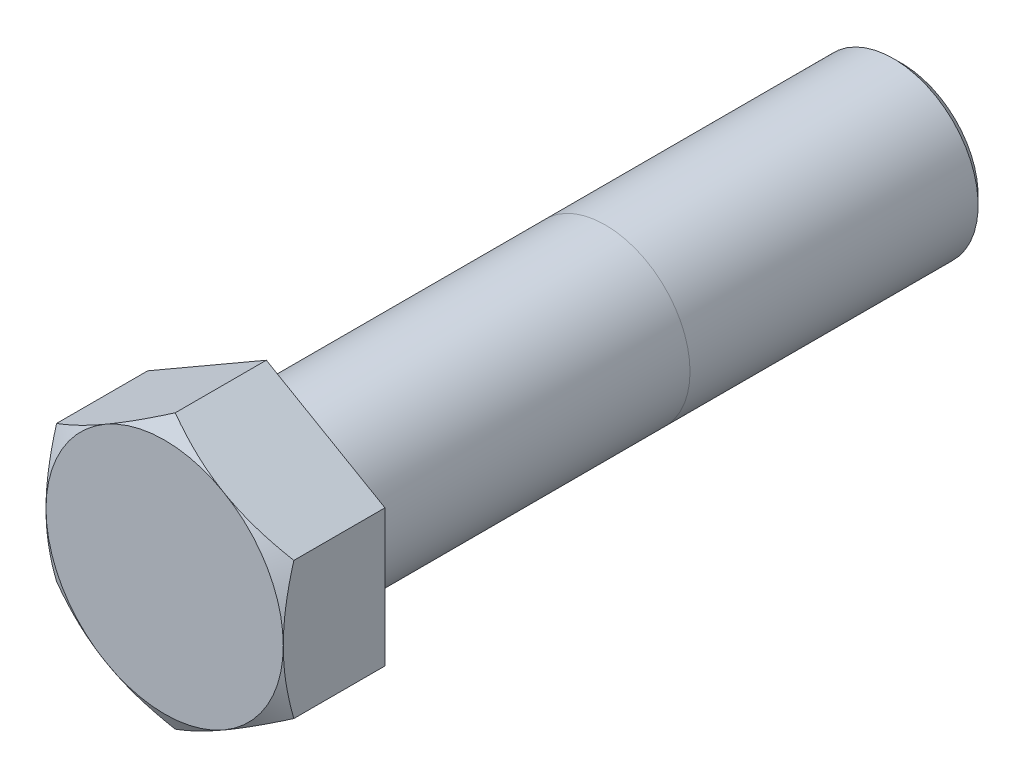
ISO-10303-21;
HEADER;
FILE_DESCRIPTION(('STEP AP214'),'2;1');
FILE_NAME('part.step','',(''),(''),'','','');
FILE_SCHEMA(('AUTOMOTIVE_DESIGN { 1 0 10303 214 1 1 1 1 }'));
ENDSEC;
DATA;
#1=APPLICATION_CONTEXT('core data for automotive mechanical design processes');
#2=APPLICATION_PROTOCOL_DEFINITION('international standard','automotive_design',2000,#1);
#3=PRODUCT_CONTEXT('',#1,'mechanical');
#4=PRODUCT('Part','Part','',(#3));
#5=PRODUCT_RELATED_PRODUCT_CATEGORY('part','',(#4));
#6=PRODUCT_DEFINITION_FORMATION('','',#4);
#7=PRODUCT_DEFINITION_CONTEXT('part definition',#1,'design');
#8=PRODUCT_DEFINITION('design','',#6,#7);
#9=PRODUCT_DEFINITION_SHAPE('','',#8);
#10=(LENGTH_UNIT() NAMED_UNIT(*) SI_UNIT(.MILLI.,.METRE.));
#11=(NAMED_UNIT(*) PLANE_ANGLE_UNIT() SI_UNIT($,.RADIAN.));
#12=(NAMED_UNIT(*) SI_UNIT($,.STERADIAN.) SOLID_ANGLE_UNIT());
#13=UNCERTAINTY_MEASURE_WITH_UNIT(LENGTH_MEASURE(1.E-05),#10,'distance_accuracy_value','');
#14=(GEOMETRIC_REPRESENTATION_CONTEXT(3) GLOBAL_UNCERTAINTY_ASSIGNED_CONTEXT((#13)) GLOBAL_UNIT_ASSIGNED_CONTEXT((#10,
#11,#12)) REPRESENTATION_CONTEXT('',''));
#15=CARTESIAN_POINT('',(0.,0.,0.));
#16=DIRECTION('',(0.,0.,1.));
#17=DIRECTION('',(1.,0.,0.));
#18=AXIS2_PLACEMENT_3D('',#15,#16,#17);
#19=CARTESIAN_POINT('',(0.,0.,-75.));
#20=DIRECTION('',(0.,0.,1.));
#21=DIRECTION('',(1.,0.,0.));
#22=AXIS2_PLACEMENT_3D('',#19,#20,#21);
#23=CYLINDRICAL_SURFACE('',#22,10.);
#24=CARTESIAN_POINT('',(0.,0.,0.));
#25=DIRECTION('',(0.,0.,-1.));
#26=DIRECTION('',(-1.,0.,0.));
#27=AXIS2_PLACEMENT_3D('',#24,#25,#26);
#28=CIRCLE('',#27,10.);
#29=CARTESIAN_POINT('',(-10.,0.,0.));
#30=VERTEX_POINT('',#29);
#31=EDGE_CURVE('E145',#30,#30,#28,.T.);
#32=ORIENTED_EDGE('',*,*,#31,.T.);
#33=EDGE_LOOP('',(#32));
#34=FACE_BOUND('',#33,.T.);
#35=CARTESIAN_POINT('',(0.,0.,-40.));
#36=DIRECTION('',(0.,0.,-1.));
#37=DIRECTION('',(-1.,0.,0.));
#38=AXIS2_PLACEMENT_3D('',#35,#36,#37);
#39=CIRCLE('',#38,10.);
#40=CARTESIAN_POINT('',(-10.,0.,-40.));
#41=VERTEX_POINT('',#40);
#42=CARTESIAN_POINT('',(10.,0.,-40.));
#43=VERTEX_POINT('',#42);
#44=EDGE_CURVE('E12',#41,#43,#39,.T.);
#45=ORIENTED_EDGE('',*,*,#44,.F.);
#46=EDGE_CURVE('E53',#43,#41,#39,.T.);
#47=ORIENTED_EDGE('',*,*,#46,.F.);
#48=EDGE_LOOP('',(#45,#47));
#49=FACE_BOUND('',#48,.T.);
#50=ADVANCED_FACE('F48',(#34,#49),#23,.T.);
#51=CARTESIAN_POINT('',(-14.,-8.08290376865476,12.));
#52=DIRECTION('',(0.5,0.866025403784439,0.));
#53=DIRECTION('',(-0.866025403784439,0.5,0.));
#54=AXIS2_PLACEMENT_3D('',#51,#52,#53);
#55=PLANE('',#54);
#56=CARTESIAN_POINT('',(-14.0002,-8.08278829860093,10.7495037679405));
#57=CARTESIAN_POINT('',(-13.6924853904181,-8.26044741127663,10.8520687355185));
#58=CARTESIAN_POINT('',(-13.3835705284393,-8.43879948999677,10.9499795109551));
#59=CARTESIAN_POINT('',(-12.7632636692859,-8.79693382210912,11.1351989694353));
#60=CARTESIAN_POINT('',(-12.4518708930622,-8.97671652528557,11.2225041654761));
#61=CARTESIAN_POINT('',(-11.8260063991707,-9.33805955931008,11.3853389062415));
#62=CARTESIAN_POINT('',(-11.5115292047329,-9.51962305217277,11.4608405894043));
#63=CARTESIAN_POINT('',(-10.8803895759989,-9.88401168671854,11.5984470625897));
#64=CARTESIAN_POINT('',(-10.5637272674325,-10.0668367558116,11.6605526168897));
#65=CARTESIAN_POINT('',(-9.93633151674919,-10.429063861357,11.7687252680104));
#66=CARTESIAN_POINT('',(-9.62564465325542,-10.6084390056288,11.8151503964399));
#67=CARTESIAN_POINT('',(-9.00284729327513,-10.968011229064,11.8929951265451));
#68=CARTESIAN_POINT('',(-8.69073676950318,-11.1482083239807,11.9244144393938));
#69=CARTESIAN_POINT('',(-8.06599141476663,-11.5089052227128,11.9714542186344));
#70=CARTESIAN_POINT('',(-7.75335765114504,-11.6894044102975,11.9870934589966));
#71=CARTESIAN_POINT('',(-7.12780152662096,-12.0505694071847,12.0022367596143));
#72=CARTESIAN_POINT('',(-6.81487917493453,-12.2312352111663,12.0017413184259));
#73=CARTESIAN_POINT('',(-6.22987230119103,-12.5689890871999,11.9857422399056));
#74=CARTESIAN_POINT('',(-5.95774609067864,-12.7261012280928,11.9721901053227));
#75=CARTESIAN_POINT('',(-5.41411962233189,-13.0399641159314,11.9331392398875));
#76=CARTESIAN_POINT('',(-5.14261941013851,-13.1967148365263,11.9076396640127));
#77=CARTESIAN_POINT('',(-4.60039240839667,-13.5097697419438,11.8451385190432));
#78=CARTESIAN_POINT('',(-4.32966644468921,-13.6660734499669,11.8081274502385));
#79=CARTESIAN_POINT('',(-3.78948373337593,-13.9779480837552,11.7232526731859));
#80=CARTESIAN_POINT('',(-3.52002707332628,-14.1335189589698,11.6753882271492));
#81=CARTESIAN_POINT('',(-2.70207638818785,-14.6057630072183,11.514304872236));
#82=CARTESIAN_POINT('',(-2.15595101855752,-14.9210686363857,11.3850242516312));
#83=CARTESIAN_POINT('',(-1.07184369066131,-15.546978293977,11.0916100987946));
#84=CARTESIAN_POINT('',(-0.533847852112653,-15.857590336186,10.9275454762133));
#85=CARTESIAN_POINT('',(0.000200000000002149,-16.1659230073634,10.7495037679405));
#86=B_SPLINE_CURVE_WITH_KNOTS('',3,(#56,#57,#58,#59,#60,#61,#62,#63,#64,#65,#66,#67,#68,#69,#70,
#71,#72,#73,#74,#75,#76,#77,#78,#79,#80,#81,#82,#83,#84,#85),.UNSPECIFIED.,.F.,.F.,(4,2,2,2,2,2,
2,2,2,2,2,2,2,2,4),(0.,1.10950436744395,2.21937254652007,3.33182219257025,4.44420835421649,
5.52913815688045,6.6140888410734,7.69774720328185,8.78137208085321,9.72469383358151,
10.6680823159394,11.6122513923123,12.5564846704803,14.4864746839191,16.412676387916),.UNSPECIFIED.);
#87=CARTESIAN_POINT('',(-14.,-8.0829037686548,10.7495704353215));
#88=VERTEX_POINT('',#87);
#89=CARTESIAN_POINT('',(-7.,-12.1243556529821,12.));
#90=VERTEX_POINT('',#89);
#91=EDGE_CURVE('E296',#88,#90,#86,.T.);
#92=ORIENTED_EDGE('',*,*,#91,.F.);
#93=DIRECTION('',(0.,0.,-1.));
#94=VECTOR('',#93,1.);
#95=CARTESIAN_POINT('',(-14.,-8.08290376865476,12.));
#96=LINE('',#95,#94);
#97=CARTESIAN_POINT('',(-14.,-8.08290376865476,0.));
#98=VERTEX_POINT('',#97);
#99=EDGE_CURVE('E272',#88,#98,#96,.T.);
#100=ORIENTED_EDGE('',*,*,#99,.T.);
#101=DIRECTION('',(0.866025403784439,-0.5,0.));
#102=VECTOR('',#101,1.);
#103=CARTESIAN_POINT('',(-14.,-8.08290376865476,0.));
#104=LINE('',#103,#102);
#105=CARTESIAN_POINT('',(0.,-16.1658075373095,0.));
#106=VERTEX_POINT('',#105);
#107=EDGE_CURVE('E293',#98,#106,#104,.T.);
#108=ORIENTED_EDGE('',*,*,#107,.T.);
#109=DIRECTION('',(0.,0.,-1.));
#110=VECTOR('',#109,1.);
#111=CARTESIAN_POINT('',(0.,-16.1658075373095,12.));
#112=LINE('',#111,#110);
#113=CARTESIAN_POINT('',(0.,-16.1658075373095,10.7495704353214));
#114=VERTEX_POINT('',#113);
#115=EDGE_CURVE('E258',#114,#106,#112,.T.);
#116=ORIENTED_EDGE('',*,*,#115,.F.);
#117=EDGE_CURVE('E198',#90,#114,#86,.T.);
#118=ORIENTED_EDGE('',*,*,#117,.F.);
#119=EDGE_LOOP('',(#92,#100,#108,#116,#118));
#120=FACE_BOUND('',#119,.T.);
#121=ADVANCED_FACE('F229',(#120),#55,.F.);
#122=CARTESIAN_POINT('',(0.,-16.1658075373095,12.));
#123=DIRECTION('',(-0.500000000000001,0.866025403784438,0.));
#124=DIRECTION('',(-0.866025403784438,-0.500000000000001,0.));
#125=AXIS2_PLACEMENT_3D('',#122,#123,#124);
#126=PLANE('',#125);
#127=CARTESIAN_POINT('',(-0.000199999999998869,-16.1659230073634,10.7495037679405));
#128=CARTESIAN_POINT('',(0.307514609581922,-15.9882638946877,10.8520687355185));
#129=CARTESIAN_POINT('',(0.61642947156072,-15.8099118159675,10.9499795109551));
#130=CARTESIAN_POINT('',(1.23673633071406,-15.4517774838552,11.1351989694353));
#131=CARTESIAN_POINT('',(1.54812910693776,-15.2719947806787,11.2225041654761));
#132=CARTESIAN_POINT('',(2.17399360082929,-14.9106517466542,11.3853389062415));
#133=CARTESIAN_POINT('',(2.48847079526713,-14.7290882537915,11.4608405894043));
#134=CARTESIAN_POINT('',(3.11961042400107,-14.3646996192458,11.5984470625896));
#135=CARTESIAN_POINT('',(3.43627273256746,-14.1818745501527,11.6605526168897));
#136=CARTESIAN_POINT('',(4.06366848325081,-13.8196474446073,11.7687252680104));
#137=CARTESIAN_POINT('',(4.37435534674457,-13.6402723003355,11.8151503964399));
#138=CARTESIAN_POINT('',(4.99715270672487,-13.2807000769003,11.8929951265451));
#139=CARTESIAN_POINT('',(5.30926323049682,-13.1005029819836,11.9244144393938));
#140=CARTESIAN_POINT('',(5.93400858523337,-12.7398060832515,11.9714542186344));
#141=CARTESIAN_POINT('',(6.24664234885497,-12.5593068956668,11.9870934589966));
#142=CARTESIAN_POINT('',(6.87219847337904,-12.1981418987796,12.0022367596143));
#143=CARTESIAN_POINT('',(7.18512082506547,-12.017476094798,12.0017413184259));
#144=CARTESIAN_POINT('',(7.77012769880897,-11.6797222187644,11.9857422399056));
#145=CARTESIAN_POINT('',(8.04225390932136,-11.5226100778715,11.9721901053227));
#146=CARTESIAN_POINT('',(8.58588037766811,-11.2087471900329,11.9331392398875));
#147=CARTESIAN_POINT('',(8.85738058986149,-11.051996469438,11.9076396640127));
#148=CARTESIAN_POINT('',(9.39960759160333,-10.7389415640205,11.8451385190432));
#149=CARTESIAN_POINT('',(9.67033355531079,-10.5826378559974,11.8081274502385));
#150=CARTESIAN_POINT('',(10.2105162666241,-10.2707632222091,11.7232526731859));
#151=CARTESIAN_POINT('',(10.4799729266737,-10.1151923469945,11.6753882271492));
#152=CARTESIAN_POINT('',(11.2979236118122,-9.64294829874594,11.514304872236));
#153=CARTESIAN_POINT('',(11.8440489814425,-9.32764266957859,11.3850242516312));
#154=CARTESIAN_POINT('',(12.9281563093387,-8.70173301198727,11.0916100987946));
#155=CARTESIAN_POINT('',(13.4661521478873,-8.3911209697783,10.9275454762133));
#156=CARTESIAN_POINT('',(14.0002,-8.08278829860092,10.7495037679405));
#157=B_SPLINE_CURVE_WITH_KNOTS('',3,(#127,#128,#129,#130,#131,#132,#133,#134,#135,#136,#137,
#138,#139,#140,#141,#142,#143,#144,#145,#146,#147,#148,#149,#150,#151,#152,#153,#154,#155,#156),
.UNSPECIFIED.,.F.,.F.,(4,2,2,2,2,2,2,2,2,2,2,2,2,2,4),(0.,1.10950436744395,2.21937254652007,
3.33182219257025,4.44420835421649,5.52913815688045,6.6140888410734,7.69774720328185,
8.78137208085321,9.72469383358151,10.6680823159394,11.6122513923123,12.5564846704803,
14.4864746839191,16.412676387916),.UNSPECIFIED.);
#158=CARTESIAN_POINT('',(7.00000000000001,-12.1243556529821,12.));
#159=VERTEX_POINT('',#158);
#160=EDGE_CURVE('E304',#114,#159,#157,.T.);
#161=ORIENTED_EDGE('',*,*,#160,.F.);
#162=ORIENTED_EDGE('',*,*,#115,.T.);
#163=DIRECTION('',(0.866025403784438,0.500000000000001,0.));
#164=VECTOR('',#163,1.);
#165=CARTESIAN_POINT('',(0.,-16.1658075373095,0.));
#166=LINE('',#165,#164);
#167=CARTESIAN_POINT('',(14.,-8.08290376865476,0.));
#168=VERTEX_POINT('',#167);
#169=EDGE_CURVE('E290',#106,#168,#166,.T.);
#170=ORIENTED_EDGE('',*,*,#169,.T.);
#171=DIRECTION('',(0.,0.,-1.));
#172=VECTOR('',#171,1.);
#173=CARTESIAN_POINT('',(14.,-8.08290376865476,12.));
#174=LINE('',#173,#172);
#175=CARTESIAN_POINT('',(14.,-8.08290376865476,10.7495704353214));
#176=VERTEX_POINT('',#175);
#177=EDGE_CURVE('E261',#176,#168,#174,.T.);
#178=ORIENTED_EDGE('',*,*,#177,.F.);
#179=EDGE_CURVE('E309',#159,#176,#157,.T.);
#180=ORIENTED_EDGE('',*,*,#179,.F.);
#181=EDGE_LOOP('',(#161,#162,#170,#178,#180));
#182=FACE_BOUND('',#181,.T.);
#183=ADVANCED_FACE('F234',(#182),#126,.F.);
#184=CARTESIAN_POINT('',(14.,-8.08290376865476,12.));
#185=DIRECTION('',(-1.,0.,0.));
#186=DIRECTION('',(0.,0.,1.));
#187=AXIS2_PLACEMENT_3D('',#184,#185,#186);
#188=PLANE('',#187);
#189=CARTESIAN_POINT('',(14.,-27.9498313890811,2.03488379712644));
#190=CARTESIAN_POINT('',(14.,-27.3001164004974,2.37023076111288));
#191=CARTESIAN_POINT('',(14.,-26.6494735941291,2.70379549218832));
#192=CARTESIAN_POINT('',(14.,-25.3458869305562,3.36647218065568));
#193=CARTESIAN_POINT('',(14.,-24.6929429660596,3.69558392686955));
#194=CARTESIAN_POINT('',(14.,-23.3833263693378,4.34895509189265));
#195=CARTESIAN_POINT('',(14.,-22.7266494511295,4.6732059344599));
#196=CARTESIAN_POINT('',(14.,-21.4100681833431,5.31507219467511));
#197=CARTESIAN_POINT('',(14.,-20.7501638839886,5.63268771517717));
#198=CARTESIAN_POINT('',(14.,-19.3911793293609,6.27639782623186));
#199=CARTESIAN_POINT('',(14.,-18.6918853351432,6.60204234665205));
#200=CARTESIAN_POINT('',(14.,-17.2879557164244,7.24172776898743));
#201=CARTESIAN_POINT('',(14.,-16.5833198771625,7.55576820136402));
#202=CARTESIAN_POINT('',(14.,-15.167908774893,8.16867739244114));
#203=CARTESIAN_POINT('',(14.,-14.4571370411742,8.46755427059979));
#204=CARTESIAN_POINT('',(14.,-13.0276643302037,9.04570148645687));
#205=CARTESIAN_POINT('',(14.,-12.3089641296015,9.32497372517713));
#206=CARTESIAN_POINT('',(14.,-11.1682733850544,9.74482799506639));
#207=CARTESIAN_POINT('',(14.,-10.7494723140834,9.89407430992688));
#208=CARTESIAN_POINT('',(14.,-9.90838165932031,10.1823750926573));
#209=CARTESIAN_POINT('',(14.,-9.48609223946529,10.3214300364788));
#210=CARTESIAN_POINT('',(14.,-8.63766324499774,10.5875993619507));
#211=CARTESIAN_POINT('',(14.,-8.21152297090498,10.7147115244666));
#212=CARTESIAN_POINT('',(14.,-7.35528655812802,10.9549202016765));
#213=CARTESIAN_POINT('',(14.,-6.92519042709696,11.0680167434794));
#214=CARTESIAN_POINT('',(14.,-6.06946764015133,11.2758840721237));
#215=CARTESIAN_POINT('',(14.,-5.64391804159869,11.3709699599945));
#216=CARTESIAN_POINT('',(14.,-4.78922316200008,11.5432633944381));
#217=CARTESIAN_POINT('',(14.,-4.36007819739461,11.6204724976302));
#218=CARTESIAN_POINT('',(14.,-3.49882659547706,11.754837881857));
#219=CARTESIAN_POINT('',(14.,-3.06672136580304,11.8120030992673));
#220=CARTESIAN_POINT('',(14.,-2.20016115354935,11.9044878213308));
#221=CARTESIAN_POINT('',(14.,-1.76570620421629,11.939807634267));
#222=CARTESIAN_POINT('',(14.,-0.889268007055268,11.9876825524609));
#223=CARTESIAN_POINT('',(14.,-0.447266252123548,11.9999034228828));
#224=CARTESIAN_POINT('',(14.,0.436742387197306,12.0000954352862));
#225=CARTESIAN_POINT('',(14.,0.878749271591216,11.9880665525097));
#226=CARTESIAN_POINT('',(14.,1.76157137210901,11.940219694343));
#227=CARTESIAN_POINT('',(14.,2.20238625641703,11.9043956669625));
#228=CARTESIAN_POINT('',(14.,3.08159302766076,11.810267664243));
#229=CARTESIAN_POINT('',(14.,3.51998485433194,11.7519631323143));
#230=CARTESIAN_POINT('',(14.,4.40241931971309,11.6134038217897));
#231=CARTESIAN_POINT('',(14.,4.84639486245937,11.5327256319502));
#232=CARTESIAN_POINT('',(14.,5.73047648575373,11.3523584685403));
#233=CARTESIAN_POINT('',(14.,6.17058218873932,11.2526676610607));
#234=CARTESIAN_POINT('',(14.,7.046775034194,11.0367258826044));
#235=CARTESIAN_POINT('',(14.,7.48286135545225,10.9204716039982));
#236=CARTESIAN_POINT('',(14.,8.35097500652423,10.6737593179844));
#237=CARTESIAN_POINT('',(14.,8.78300231680721,10.5433012422703));
#238=CARTESIAN_POINT('',(14.,9.63319530104947,10.2734644154145));
#239=CARTESIAN_POINT('',(14.,10.0514496779824,10.1343636924935));
#240=CARTESIAN_POINT('',(14.,10.8845668621142,9.84632731004815));
#241=CARTESIAN_POINT('',(14.,11.2994295120695,9.69739119741875));
#242=CARTESIAN_POINT('',(14.,12.1261353881979,9.39112136186719));
#243=CARTESIAN_POINT('',(14.,12.537977942553,9.23378583131533));
#244=CARTESIAN_POINT('',(14.,13.358854273979,8.91198598962461));
#245=CARTESIAN_POINT('',(14.,13.7678880916329,8.74752178173891));
#246=CARTESIAN_POINT('',(14.,14.5839202435863,8.41230801263024));
#247=CARTESIAN_POINT('',(14.,14.9909156752664,8.24155139938857));
#248=CARTESIAN_POINT('',(14.,15.8026699480744,7.89479563942912));
#249=CARTESIAN_POINT('',(14.,16.20742875239,7.7187964067267));
#250=CARTESIAN_POINT('',(14.,17.4186205811024,7.18410896270162));
#251=CARTESIAN_POINT('',(14.,18.222081485259,6.81868431848693));
#252=CARTESIAN_POINT('',(14.,19.7762175122285,6.09600771684722));
#253=CARTESIAN_POINT('',(14.,20.5272475672054,5.73951424702883));
#254=CARTESIAN_POINT('',(14.,22.0248444765253,5.0172213493397));
#255=CARTESIAN_POINT('',(14.,22.7714111743984,4.65142159755785));
#256=CARTESIAN_POINT('',(14.,24.2583278595973,3.9137722793019));
#257=CARTESIAN_POINT('',(14.,24.9986904161942,3.54194800035149));
#258=CARTESIAN_POINT('',(14.,26.1069781380862,2.97985081028368));
#259=CARTESIAN_POINT('',(14.,26.4760158168577,2.79176632306055));
#260=CARTESIAN_POINT('',(14.,27.2134142676695,2.41427909262906));
#261=CARTESIAN_POINT('',(14.,27.581775042861,2.22487635557732));
#262=CARTESIAN_POINT('',(14.,27.9498313890811,2.03488379712644));
#263=B_SPLINE_CURVE_WITH_KNOTS('',3,(#189,#190,#191,#192,#193,#194,#195,#196,#197,#198,#199,
#200,#201,#202,#203,#204,#205,#206,#207,#208,#209,#210,#211,#212,#213,#214,#215,#216,#217,#218,
#219,#220,#221,#222,#223,#224,#225,#226,#227,#228,#229,#230,#231,#232,#233,#234,#235,#236,#237,
#238,#239,#240,#241,#242,#243,#244,#245,#246,#247,#248,#249,#250,#251,#252,#253,#254,#255,#256,
#257,#258,#259,#260,#261,#262),.UNSPECIFIED.,.F.,.F.,(4,2,2,2,2,2,2,2,2,2,2,2,2,2,2,2,2,2,2,2,2,
2,2,2,2,2,2,2,2,2,2,2,2,2,2,2,4),(0.,2.19347176186133,4.38704718473205,6.5841211787642,
8.78116109065344,11.0952767189595,13.4094858814932,15.7224425113349,18.035174547799,
19.3688685705576,20.7025002681792,22.0363792850161,23.3702557218224,24.678049280889,
25.9857289211006,27.2928248012449,28.5999022351851,29.9257520686343,31.2516032557345,
32.5777917852944,33.9040131517597,35.2572819955675,36.6106814383634,37.9643515270124,
39.3180281257888,40.6402225516445,41.9624779320168,43.2850190297716,44.6075409779794,
45.9315930896242,47.2556669291279,49.9034493909698,52.3974119375353,54.8914614071462,
57.3768884544875,58.6194969900369,59.8620997261258),.UNSPECIFIED.);
#264=CARTESIAN_POINT('',(14.,0.,12.));
#265=VERTEX_POINT('',#264);
#266=EDGE_CURVE('E311',#176,#265,#263,.T.);
#267=ORIENTED_EDGE('',*,*,#266,.F.);
#268=ORIENTED_EDGE('',*,*,#177,.T.);
#269=DIRECTION('',(0.,1.,0.));
#270=VECTOR('',#269,1.);
#271=CARTESIAN_POINT('',(14.,-8.08290376865476,0.));
#272=LINE('',#271,#270);
#273=CARTESIAN_POINT('',(14.,8.08290376865476,0.));
#274=VERTEX_POINT('',#273);
#275=EDGE_CURVE('E286',#168,#274,#272,.T.);
#276=ORIENTED_EDGE('',*,*,#275,.T.);
#277=DIRECTION('',(0.,0.,-1.));
#278=VECTOR('',#277,1.);
#279=CARTESIAN_POINT('',(14.,8.08290376865476,12.));
#280=LINE('',#279,#278);
#281=CARTESIAN_POINT('',(14.,8.08290376865476,10.7495704353214));
#282=VERTEX_POINT('',#281);
#283=EDGE_CURVE('E264',#282,#274,#280,.T.);
#284=ORIENTED_EDGE('',*,*,#283,.F.);
#285=EDGE_CURVE('E128',#265,#282,#263,.T.);
#286=ORIENTED_EDGE('',*,*,#285,.F.);
#287=EDGE_LOOP('',(#267,#268,#276,#284,#286));
#288=FACE_BOUND('',#287,.T.);
#289=ADVANCED_FACE('F227',(#288),#188,.F.);
#290=CARTESIAN_POINT('',(14.,8.08290376865476,12.));
#291=DIRECTION('',(-0.5,-0.866025403784439,0.));
#292=DIRECTION('',(0.866025403784439,-0.5,0.));
#293=AXIS2_PLACEMENT_3D('',#290,#291,#292);
#294=PLANE('',#293);
#295=CARTESIAN_POINT('',(14.0002,8.08278829860092,10.7495037679405));
#296=CARTESIAN_POINT('',(13.6924853904181,8.26044741127662,10.8520687355185));
#297=CARTESIAN_POINT('',(13.3835705284393,8.43879948999676,10.9499795109551));
#298=CARTESIAN_POINT('',(12.7632636692859,8.79693382210911,11.1351989694353));
#299=CARTESIAN_POINT('',(12.4518708930622,8.97671652528557,11.2225041654761));
#300=CARTESIAN_POINT('',(11.8260063991707,9.33805955931007,11.3853389062415));
#301=CARTESIAN_POINT('',(11.5115292047329,9.51962305217276,11.4608405894043));
#302=CARTESIAN_POINT('',(10.8803895759989,9.88401168671853,11.5984470625897));
#303=CARTESIAN_POINT('',(10.5637272674325,10.0668367558115,11.6605526168897));
#304=CARTESIAN_POINT('',(9.93633151674919,10.429063861357,11.7687252680104));
#305=CARTESIAN_POINT('',(9.62564465325543,10.6084390056288,11.8151503964399));
#306=CARTESIAN_POINT('',(9.00284729327513,10.968011229064,11.8929951265451));
#307=CARTESIAN_POINT('',(8.69073676950318,11.1482083239807,11.9244144393938));
#308=CARTESIAN_POINT('',(8.06599141476664,11.5089052227128,11.9714542186344));
#309=CARTESIAN_POINT('',(7.75335765114504,11.6894044102975,11.9870934589966));
#310=CARTESIAN_POINT('',(7.12780152662097,12.0505694071847,12.0022367596143));
#311=CARTESIAN_POINT('',(6.81487917493454,12.2312352111663,12.0017413184259));
#312=CARTESIAN_POINT('',(6.22987230119104,12.5689890871999,11.9857422399056));
#313=CARTESIAN_POINT('',(5.95774609067865,12.7261012280928,11.9721901053227));
#314=CARTESIAN_POINT('',(5.4141196223319,13.0399641159314,11.9331392398875));
#315=CARTESIAN_POINT('',(5.14261941013852,13.1967148365263,11.9076396640127));
#316=CARTESIAN_POINT('',(4.60039240839668,13.5097697419438,11.8451385190432));
#317=CARTESIAN_POINT('',(4.32966644468922,13.6660734499669,11.8081274502385));
#318=CARTESIAN_POINT('',(3.78948373337593,13.9779480837552,11.7232526731859));
#319=CARTESIAN_POINT('',(3.52002707332628,14.1335189589698,11.6753882271492));
#320=CARTESIAN_POINT('',(2.70207638818785,14.6057630072183,11.514304872236));
#321=CARTESIAN_POINT('',(2.15595101855752,14.9210686363857,11.3850242516312));
#322=CARTESIAN_POINT('',(1.07184369066131,15.546978293977,11.0916100987946));
#323=CARTESIAN_POINT('',(0.533847852112654,15.857590336186,10.9275454762133));
#324=CARTESIAN_POINT('',(-0.000200000000004244,16.1659230073634,10.7495037679405));
#325=B_SPLINE_CURVE_WITH_KNOTS('',3,(#295,#296,#297,#298,#299,#300,#301,#302,#303,#304,#305,
#306,#307,#308,#309,#310,#311,#312,#313,#314,#315,#316,#317,#318,#319,#320,#321,#322,#323,#324),
.UNSPECIFIED.,.F.,.F.,(4,2,2,2,2,2,2,2,2,2,2,2,2,2,4),(0.,1.10950436744395,2.21937254652007,
3.33182219257025,4.44420835421649,5.52913815688045,6.6140888410734,7.69774720328185,
8.78137208085321,9.72469383358151,10.6680823159394,11.6122513923123,12.5564846704803,
14.4864746839191,16.412676387916),.UNSPECIFIED.);
#326=CARTESIAN_POINT('',(7.,12.1243556529821,12.));
#327=VERTEX_POINT('',#326);
#328=EDGE_CURVE('E121',#282,#327,#325,.T.);
#329=ORIENTED_EDGE('',*,*,#328,.F.);
#330=ORIENTED_EDGE('',*,*,#283,.T.);
#331=DIRECTION('',(-0.866025403784439,0.5,0.));
#332=VECTOR('',#331,1.);
#333=CARTESIAN_POINT('',(14.,8.08290376865476,0.));
#334=LINE('',#333,#332);
#335=CARTESIAN_POINT('',(0.,16.1658075373095,0.));
#336=VERTEX_POINT('',#335);
#337=EDGE_CURVE('E283',#274,#336,#334,.T.);
#338=ORIENTED_EDGE('',*,*,#337,.T.);
#339=DIRECTION('',(0.,0.,-1.));
#340=VECTOR('',#339,1.);
#341=CARTESIAN_POINT('',(0.,16.1658075373095,12.));
#342=LINE('',#341,#340);
#343=CARTESIAN_POINT('',(0.,16.1658075373095,10.7495704353214));
#344=VERTEX_POINT('',#343);
#345=EDGE_CURVE('E159',#344,#336,#342,.T.);
#346=ORIENTED_EDGE('',*,*,#345,.F.);
#347=EDGE_CURVE('E133',#327,#344,#325,.T.);
#348=ORIENTED_EDGE('',*,*,#347,.F.);
#349=EDGE_LOOP('',(#329,#330,#338,#346,#348));
#350=FACE_BOUND('',#349,.T.);
#351=ADVANCED_FACE('F157',(#350),#294,.F.);
#352=CARTESIAN_POINT('',(0.,16.1658075373095,12.));
#353=DIRECTION('',(0.5,-0.866025403784439,0.));
#354=DIRECTION('',(0.866025403784439,0.5,0.));
#355=AXIS2_PLACEMENT_3D('',#352,#353,#354);
#356=PLANE('',#355);
#357=CARTESIAN_POINT('',(0.000199999999996645,16.1659230073634,10.7495037679405));
#358=CARTESIAN_POINT('',(-0.307514609581924,15.9882638946877,10.8520687355185));
#359=CARTESIAN_POINT('',(-0.616429471560721,15.8099118159675,10.9499795109551));
#360=CARTESIAN_POINT('',(-1.23673633071406,15.4517774838552,11.1351989694353));
#361=CARTESIAN_POINT('',(-1.54812910693776,15.2719947806787,11.2225041654761));
#362=CARTESIAN_POINT('',(-2.17399360082929,14.9106517466542,11.3853389062415));
#363=CARTESIAN_POINT('',(-2.48847079526713,14.7290882537915,11.4608405894043));
#364=CARTESIAN_POINT('',(-3.11961042400107,14.3646996192457,11.5984470625897));
#365=CARTESIAN_POINT('',(-3.43627273256746,14.1818745501527,11.6605526168897));
#366=CARTESIAN_POINT('',(-4.06366848325081,13.8196474446073,11.7687252680104));
#367=CARTESIAN_POINT('',(-4.37435534674457,13.6402723003355,11.8151503964399));
#368=CARTESIAN_POINT('',(-4.99715270672487,13.2807000769003,11.8929951265451));
#369=CARTESIAN_POINT('',(-5.30926323049682,13.1005029819836,11.9244144393938));
#370=CARTESIAN_POINT('',(-5.93400858523337,12.7398060832515,11.9714542186344));
#371=CARTESIAN_POINT('',(-6.24664234885496,12.5593068956668,11.9870934589966));
#372=CARTESIAN_POINT('',(-6.87219847337904,12.1981418987796,12.0022367596143));
#373=CARTESIAN_POINT('',(-7.18512082506547,12.017476094798,12.0017413184259));
#374=CARTESIAN_POINT('',(-7.77012769880897,11.6797222187644,11.9857422399056));
#375=CARTESIAN_POINT('',(-8.04225390932136,11.5226100778715,11.9721901053227));
#376=CARTESIAN_POINT('',(-8.58588037766811,11.2087471900329,11.9331392398875));
#377=CARTESIAN_POINT('',(-8.85738058986149,11.051996469438,11.9076396640127));
#378=CARTESIAN_POINT('',(-9.39960759160332,10.7389415640205,11.8451385190432));
#379=CARTESIAN_POINT('',(-9.67033355531079,10.5826378559974,11.8081274502385));
#380=CARTESIAN_POINT('',(-10.2105162666241,10.2707632222091,11.7232526731859));
#381=CARTESIAN_POINT('',(-10.4799729266737,10.1151923469945,11.6753882271492));
#382=CARTESIAN_POINT('',(-11.2979236118122,9.64294829874594,11.514304872236));
#383=CARTESIAN_POINT('',(-11.8440489814425,9.32764266957859,11.3850242516312));
#384=CARTESIAN_POINT('',(-12.9281563093387,8.70173301198727,11.0916100987946));
#385=CARTESIAN_POINT('',(-13.4661521478873,8.3911209697783,10.9275454762133));
#386=CARTESIAN_POINT('',(-14.0002,8.08278829860092,10.7495037679405));
#387=B_SPLINE_CURVE_WITH_KNOTS('',3,(#357,#358,#359,#360,#361,#362,#363,#364,#365,#366,#367,
#368,#369,#370,#371,#372,#373,#374,#375,#376,#377,#378,#379,#380,#381,#382,#383,#384,#385,#386),
.UNSPECIFIED.,.F.,.F.,(4,2,2,2,2,2,2,2,2,2,2,2,2,2,4),(0.,1.10950436744395,2.21937254652007,
3.33182219257025,4.44420835421649,5.52913815688044,6.61408884107339,7.69774720328185,
8.7813720808532,9.72469383358151,10.6680823159393,11.6122513923123,12.5564846704803,
14.4864746839191,16.412676387916),.UNSPECIFIED.);
#388=CARTESIAN_POINT('',(-7.,12.1243556529821,12.));
#389=VERTEX_POINT('',#388);
#390=EDGE_CURVE('E140',#344,#389,#387,.T.);
#391=ORIENTED_EDGE('',*,*,#390,.F.);
#392=ORIENTED_EDGE('',*,*,#345,.T.);
#393=DIRECTION('',(-0.866025403784438,-0.5,0.));
#394=VECTOR('',#393,1.);
#395=CARTESIAN_POINT('',(0.,16.1658075373095,0.));
#396=LINE('',#395,#394);
#397=CARTESIAN_POINT('',(-14.,8.08290376865476,0.));
#398=VERTEX_POINT('',#397);
#399=EDGE_CURVE('E279',#336,#398,#396,.T.);
#400=ORIENTED_EDGE('',*,*,#399,.T.);
#401=DIRECTION('',(0.,0.,-1.));
#402=VECTOR('',#401,1.);
#403=CARTESIAN_POINT('',(-14.,8.08290376865476,12.));
#404=LINE('',#403,#402);
#405=CARTESIAN_POINT('',(-14.,8.08290376865476,10.7495704353214));
#406=VERTEX_POINT('',#405);
#407=EDGE_CURVE('E269',#406,#398,#404,.T.);
#408=ORIENTED_EDGE('',*,*,#407,.F.);
#409=EDGE_CURVE('E162',#389,#406,#387,.T.);
#410=ORIENTED_EDGE('',*,*,#409,.F.);
#411=EDGE_LOOP('',(#391,#392,#400,#408,#410));
#412=FACE_BOUND('',#411,.T.);
#413=ADVANCED_FACE('F219',(#412),#356,.F.);
#414=CARTESIAN_POINT('',(-14.,8.08290376865476,12.));
#415=DIRECTION('',(1.,0.,0.));
#416=DIRECTION('',(0.,0.,-1.));
#417=AXIS2_PLACEMENT_3D('',#414,#415,#416);
#418=PLANE('',#417);
#419=CARTESIAN_POINT('',(-14.,27.9498313890811,2.03488379712644));
#420=CARTESIAN_POINT('',(-14.,27.3001164004974,2.37023076111287));
#421=CARTESIAN_POINT('',(-14.,26.6494735941291,2.70379549218831));
#422=CARTESIAN_POINT('',(-14.,25.3458869305562,3.36647218065568));
#423=CARTESIAN_POINT('',(-14.,24.6929429660596,3.69558392686955));
#424=CARTESIAN_POINT('',(-14.,23.3833263693378,4.34895509189265));
#425=CARTESIAN_POINT('',(-14.,22.7266494511295,4.6732059344599));
#426=CARTESIAN_POINT('',(-14.,21.4100681833431,5.31507219467511));
#427=CARTESIAN_POINT('',(-14.,20.7501638839886,5.63268771517716));
#428=CARTESIAN_POINT('',(-14.,19.391179329361,6.27639782623186));
#429=CARTESIAN_POINT('',(-14.,18.6918853351432,6.60204234665205));
#430=CARTESIAN_POINT('',(-14.,17.2879557164244,7.24172776898743));
#431=CARTESIAN_POINT('',(-14.,16.5833198771625,7.55576820136402));
#432=CARTESIAN_POINT('',(-14.,15.167908774893,8.16867739244114));
#433=CARTESIAN_POINT('',(-14.,14.4571370411742,8.46755427059979));
#434=CARTESIAN_POINT('',(-14.,13.0276643302037,9.04570148645687));
#435=CARTESIAN_POINT('',(-14.,12.3089641296015,9.32497372517713));
#436=CARTESIAN_POINT('',(-14.,11.1682733850545,9.74482799506639));
#437=CARTESIAN_POINT('',(-14.,10.7494723140834,9.89407430992688));
#438=CARTESIAN_POINT('',(-14.,9.90838165932031,10.1823750926573));
#439=CARTESIAN_POINT('',(-14.,9.48609223946529,10.3214300364788));
#440=CARTESIAN_POINT('',(-14.,8.63766324499775,10.5875993619507));
#441=CARTESIAN_POINT('',(-14.,8.21152297090499,10.7147115244666));
#442=CARTESIAN_POINT('',(-14.,7.35528655812802,10.9549202016765));
#443=CARTESIAN_POINT('',(-14.,6.92519042709697,11.0680167434794));
#444=CARTESIAN_POINT('',(-14.,6.06946764015134,11.2758840721237));
#445=CARTESIAN_POINT('',(-14.,5.6439180415987,11.3709699599945));
#446=CARTESIAN_POINT('',(-14.,4.78922316200009,11.5432633944381));
#447=CARTESIAN_POINT('',(-14.,4.36007819739462,11.6204724976302));
#448=CARTESIAN_POINT('',(-14.,3.49882659547707,11.754837881857));
#449=CARTESIAN_POINT('',(-14.,3.06672136580305,11.8120030992673));
#450=CARTESIAN_POINT('',(-14.,2.20016115354936,11.9044878213308));
#451=CARTESIAN_POINT('',(-14.,1.7657062042163,11.939807634267));
#452=CARTESIAN_POINT('',(-14.,0.889268007055278,11.9876825524609));
#453=CARTESIAN_POINT('',(-14.,0.447266252123557,11.9999034228828));
#454=CARTESIAN_POINT('',(-14.,-0.436742387197297,12.0000954352862));
#455=CARTESIAN_POINT('',(-14.,-0.878749271591207,11.9880665525097));
#456=CARTESIAN_POINT('',(-14.,-1.761571372109,11.940219694343));
#457=CARTESIAN_POINT('',(-14.,-2.20238625641702,11.9043956669625));
#458=CARTESIAN_POINT('',(-14.,-3.08159302766075,11.810267664243));
#459=CARTESIAN_POINT('',(-14.,-3.51998485433193,11.7519631323143));
#460=CARTESIAN_POINT('',(-14.,-4.40241931971307,11.6134038217897));
#461=CARTESIAN_POINT('',(-14.,-4.84639486245935,11.5327256319502));
#462=CARTESIAN_POINT('',(-14.,-5.73047648575371,11.3523584685403));
#463=CARTESIAN_POINT('',(-14.,-6.1705821887393,11.2526676610607));
#464=CARTESIAN_POINT('',(-14.,-7.04677503419399,11.0367258826044));
#465=CARTESIAN_POINT('',(-14.,-7.48286135545224,10.9204716039982));
#466=CARTESIAN_POINT('',(-14.,-8.35097500652422,10.6737593179844));
#467=CARTESIAN_POINT('',(-14.,-8.78300231680719,10.5433012422703));
#468=CARTESIAN_POINT('',(-14.,-9.63319530104945,10.2734644154145));
#469=CARTESIAN_POINT('',(-14.,-10.0514496779823,10.1343636924935));
#470=CARTESIAN_POINT('',(-14.,-10.8845668621142,9.84632731004816));
#471=CARTESIAN_POINT('',(-14.,-11.2994295120695,9.69739119741875));
#472=CARTESIAN_POINT('',(-14.,-12.1261353881978,9.39112136186719));
#473=CARTESIAN_POINT('',(-14.,-12.537977942553,9.23378583131534));
#474=CARTESIAN_POINT('',(-14.,-13.358854273979,8.91198598962462));
#475=CARTESIAN_POINT('',(-14.,-13.7678880916329,8.74752178173891));
#476=CARTESIAN_POINT('',(-14.,-14.5839202435863,8.41230801263024));
#477=CARTESIAN_POINT('',(-14.,-14.9909156752664,8.24155139938857));
#478=CARTESIAN_POINT('',(-14.,-15.8026699480744,7.89479563942913));
#479=CARTESIAN_POINT('',(-14.,-16.2074287523899,7.71879640672671));
#480=CARTESIAN_POINT('',(-14.,-17.4186205811024,7.18410896270162));
#481=CARTESIAN_POINT('',(-14.,-18.222081485259,6.81868431848693));
#482=CARTESIAN_POINT('',(-14.,-19.7762175122285,6.09600771684722));
#483=CARTESIAN_POINT('',(-14.,-20.5272475672054,5.73951424702883));
#484=CARTESIAN_POINT('',(-14.,-22.0248444765253,5.01722134933971));
#485=CARTESIAN_POINT('',(-14.,-22.7714111743984,4.65142159755785));
#486=CARTESIAN_POINT('',(-14.,-24.2583278595973,3.9137722793019));
#487=CARTESIAN_POINT('',(-14.,-24.9986904161942,3.54194800035148));
#488=CARTESIAN_POINT('',(-14.,-26.1069781380862,2.97985081028368));
#489=CARTESIAN_POINT('',(-14.,-26.4760158168577,2.79176632306055));
#490=CARTESIAN_POINT('',(-14.,-27.2134142676695,2.41427909262906));
#491=CARTESIAN_POINT('',(-14.,-27.581775042861,2.22487635557732));
#492=CARTESIAN_POINT('',(-14.,-27.9498313890811,2.03488379712643));
#493=B_SPLINE_CURVE_WITH_KNOTS('',3,(#419,#420,#421,#422,#423,#424,#425,#426,#427,#428,#429,
#430,#431,#432,#433,#434,#435,#436,#437,#438,#439,#440,#441,#442,#443,#444,#445,#446,#447,#448,
#449,#450,#451,#452,#453,#454,#455,#456,#457,#458,#459,#460,#461,#462,#463,#464,#465,#466,#467,
#468,#469,#470,#471,#472,#473,#474,#475,#476,#477,#478,#479,#480,#481,#482,#483,#484,#485,#486,
#487,#488,#489,#490,#491,#492),.UNSPECIFIED.,.F.,.F.,(4,2,2,2,2,2,2,2,2,2,2,2,2,2,2,2,2,2,2,2,2,
2,2,2,2,2,2,2,2,2,2,2,2,2,2,2,4),(0.,2.19347176186133,4.38704718473205,6.58412117876421,
8.78116109065344,11.0952767189595,13.4094858814932,15.7224425113349,18.035174547799,
19.3688685705576,20.7025002681792,22.0363792850161,23.3702557218224,24.678049280889,
25.9857289211006,27.2928248012449,28.5999022351851,29.9257520686343,31.2516032557345,
32.5777917852944,33.9040131517597,35.2572819955675,36.6106814383634,37.9643515270124,
39.3180281257888,40.6402225516445,41.9624779320168,43.2850190297716,44.6075409779794,
45.9315930896242,47.2556669291279,49.9034493909699,52.3974119375353,54.8914614071462,
57.3768884544876,58.6194969900369,59.8620997261259),.UNSPECIFIED.);
#494=CARTESIAN_POINT('',(-14.,0.,12.));
#495=VERTEX_POINT('',#494);
#496=EDGE_CURVE('E213',#406,#495,#493,.T.);
#497=ORIENTED_EDGE('',*,*,#496,.F.);
#498=ORIENTED_EDGE('',*,*,#407,.T.);
#499=DIRECTION('',(0.,-1.,0.));
#500=VECTOR('',#499,1.);
#501=CARTESIAN_POINT('',(-14.,8.08290376865476,0.));
#502=LINE('',#501,#500);
#503=EDGE_CURVE('E275',#398,#98,#502,.T.);
#504=ORIENTED_EDGE('',*,*,#503,.T.);
#505=ORIENTED_EDGE('',*,*,#99,.F.);
#506=EDGE_CURVE('E154',#495,#88,#493,.T.);
#507=ORIENTED_EDGE('',*,*,#506,.F.);
#508=EDGE_LOOP('',(#497,#498,#504,#505,#507));
#509=FACE_BOUND('',#508,.T.);
#510=ADVANCED_FACE('F215',(#509),#418,.F.);
#511=CARTESIAN_POINT('',(0.,0.,0.));
#512=DIRECTION('',(0.,0.,1.));
#513=DIRECTION('',(1.,0.,0.));
#514=AXIS2_PLACEMENT_3D('',#511,#512,#513);
#515=PLANE('',#514);
#516=ORIENTED_EDGE('',*,*,#31,.F.);
#517=EDGE_LOOP('',(#516));
#518=FACE_BOUND('',#517,.T.);
#519=ORIENTED_EDGE('',*,*,#107,.F.);
#520=ORIENTED_EDGE('',*,*,#503,.F.);
#521=ORIENTED_EDGE('',*,*,#399,.F.);
#522=ORIENTED_EDGE('',*,*,#337,.F.);
#523=ORIENTED_EDGE('',*,*,#275,.F.);
#524=ORIENTED_EDGE('',*,*,#169,.F.);
#525=EDGE_LOOP('',(#519,#520,#521,#522,#523,#524));
#526=FACE_BOUND('',#525,.T.);
#527=ADVANCED_FACE('F218',(#518,#526),#515,.F.);
#528=CARTESIAN_POINT('',(0.,0.,12.));
#529=DIRECTION('',(0.,0.,-1.));
#530=DIRECTION('',(1.,0.,0.));
#531=AXIS2_PLACEMENT_3D('',#528,#529,#530);
#532=CONICAL_SURFACE('',#531,14.,1.0471975511966);
#533=ORIENTED_EDGE('',*,*,#179,.T.);
#534=ORIENTED_EDGE('',*,*,#266,.T.);
#535=CARTESIAN_POINT('',(0.,0.,12.));
#536=DIRECTION('',(0.,0.,1.));
#537=DIRECTION('',(1.,0.,0.));
#538=AXIS2_PLACEMENT_3D('',#535,#536,#537);
#539=CIRCLE('',#538,14.);
#540=EDGE_CURVE('E148',#159,#265,#539,.T.);
#541=ORIENTED_EDGE('',*,*,#540,.F.);
#542=EDGE_LOOP('',(#533,#534,#541));
#543=FACE_BOUND('',#542,.T.);
#544=ADVANCED_FACE('F351',(#543),#532,.T.);
#545=ORIENTED_EDGE('',*,*,#117,.T.);
#546=ORIENTED_EDGE('',*,*,#160,.T.);
#547=EDGE_CURVE('E257',#90,#159,#539,.T.);
#548=ORIENTED_EDGE('',*,*,#547,.F.);
#549=EDGE_LOOP('',(#545,#546,#548));
#550=FACE_BOUND('',#549,.T.);
#551=ADVANCED_FACE('F190',(#550),#532,.T.);
#552=ORIENTED_EDGE('',*,*,#91,.T.);
#553=EDGE_CURVE('E346',#495,#90,#539,.T.);
#554=ORIENTED_EDGE('',*,*,#553,.F.);
#555=ORIENTED_EDGE('',*,*,#506,.T.);
#556=EDGE_LOOP('',(#552,#554,#555));
#557=FACE_BOUND('',#556,.T.);
#558=ADVANCED_FACE('F184',(#557),#532,.T.);
#559=ORIENTED_EDGE('',*,*,#409,.T.);
#560=ORIENTED_EDGE('',*,*,#496,.T.);
#561=EDGE_CURVE('E146',#389,#495,#539,.T.);
#562=ORIENTED_EDGE('',*,*,#561,.F.);
#563=EDGE_LOOP('',(#559,#560,#562));
#564=FACE_BOUND('',#563,.T.);
#565=ADVANCED_FACE('F189',(#564),#532,.T.);
#566=ORIENTED_EDGE('',*,*,#347,.T.);
#567=ORIENTED_EDGE('',*,*,#390,.T.);
#568=EDGE_CURVE('E137',#327,#389,#539,.T.);
#569=ORIENTED_EDGE('',*,*,#568,.F.);
#570=EDGE_LOOP('',(#566,#567,#569));
#571=FACE_BOUND('',#570,.T.);
#572=ADVANCED_FACE('F138',(#571),#532,.T.);
#573=ORIENTED_EDGE('',*,*,#285,.T.);
#574=ORIENTED_EDGE('',*,*,#328,.T.);
#575=CARTESIAN_POINT('',(0.,0.,12.));
#576=DIRECTION('',(0.,0.,1.));
#577=DIRECTION('',(1.,0.,0.));
#578=AXIS2_PLACEMENT_3D('',#575,#576,#577);
#579=CIRCLE('',#578,14.);
#580=EDGE_CURVE('E125',#265,#327,#579,.T.);
#581=ORIENTED_EDGE('',*,*,#580,.F.);
#582=EDGE_LOOP('',(#573,#574,#581));
#583=FACE_BOUND('',#582,.T.);
#584=ADVANCED_FACE('F123',(#583),#532,.T.);
#585=CARTESIAN_POINT('',(0.,0.,12.));
#586=DIRECTION('',(0.,0.,1.));
#587=DIRECTION('',(1.,0.,0.));
#588=AXIS2_PLACEMENT_3D('',#585,#586,#587);
#589=PLANE('',#588);
#590=ORIENTED_EDGE('',*,*,#540,.T.);
#591=ORIENTED_EDGE('',*,*,#580,.T.);
#592=ORIENTED_EDGE('',*,*,#568,.T.);
#593=ORIENTED_EDGE('',*,*,#561,.T.);
#594=ORIENTED_EDGE('',*,*,#553,.T.);
#595=ORIENTED_EDGE('',*,*,#547,.T.);
#596=EDGE_LOOP('',(#590,#591,#592,#593,#594,#595));
#597=FACE_BOUND('',#596,.T.);
#598=ADVANCED_FACE('F150',(#597),#589,.T.);
#599=ORIENTED_EDGE('',*,*,#46,.T.);
#600=ORIENTED_EDGE('',*,*,#44,.T.);
#601=EDGE_LOOP('',(#599,#600));
#602=FACE_BOUND('',#601,.T.);
#603=CARTESIAN_POINT('',(0.,0.,-74.));
#604=DIRECTION('',(0.,0.,-1.));
#605=DIRECTION('',(-1.,0.,0.));
#606=AXIS2_PLACEMENT_3D('',#603,#604,#605);
#607=CIRCLE('',#606,10.);
#608=CARTESIAN_POINT('',(-10.,0.,-74.));
#609=VERTEX_POINT('',#608);
#610=EDGE_CURVE('E247',#609,#609,#607,.F.);
#611=ORIENTED_EDGE('',*,*,#610,.T.);
#612=EDGE_LOOP('',(#611));
#613=FACE_BOUND('',#612,.T.);
#614=ADVANCED_FACE('F192',(#602,#613),#23,.T.);
#615=CARTESIAN_POINT('',(0.,0.,-75.));
#616=DIRECTION('',(0.,0.,-1.));
#617=DIRECTION('',(-1.,0.,0.));
#618=AXIS2_PLACEMENT_3D('',#615,#616,#617);
#619=PLANE('',#618);
#620=CARTESIAN_POINT('',(0.,0.,-75.));
#621=DIRECTION('',(0.,0.,-1.));
#622=DIRECTION('',(-1.,0.,0.));
#623=AXIS2_PLACEMENT_3D('',#620,#621,#622);
#624=CIRCLE('',#623,9.);
#625=CARTESIAN_POINT('',(-9.,0.,-75.));
#626=VERTEX_POINT('',#625);
#627=EDGE_CURVE('E250',#626,#626,#624,.T.);
#628=ORIENTED_EDGE('',*,*,#627,.T.);
#629=EDGE_LOOP('',(#628));
#630=FACE_BOUND('',#629,.T.);
#631=ADVANCED_FACE('F238',(#630),#619,.T.);
#632=CARTESIAN_POINT('',(0.,0.,-75.));
#633=DIRECTION('',(0.,0.,1.));
#634=DIRECTION('',(1.,0.,0.));
#635=AXIS2_PLACEMENT_3D('',#632,#633,#634);
#636=CONICAL_SURFACE('',#635,9.,0.785398163397447);
#637=ORIENTED_EDGE('',*,*,#610,.F.);
#638=EDGE_LOOP('',(#637));
#639=FACE_BOUND('',#638,.T.);
#640=ORIENTED_EDGE('',*,*,#627,.F.);
#641=EDGE_LOOP('',(#640));
#642=FACE_BOUND('',#641,.T.);
#643=ADVANCED_FACE('F51',(#639,#642),#636,.T.);
#644=CLOSED_SHELL('',(#50,#121,#183,#289,#351,#413,#510,#527,#544,#551,#558,#565,#572,#584,#598,
#614,#631,#643));
#645=MANIFOLD_SOLID_BREP('B2',#644);
#646=ADVANCED_BREP_SHAPE_REPRESENTATION('',(#18,#645),#14);
#647=SHAPE_DEFINITION_REPRESENTATION(#9,#646);
ENDSEC;
END-ISO-10303-21;
